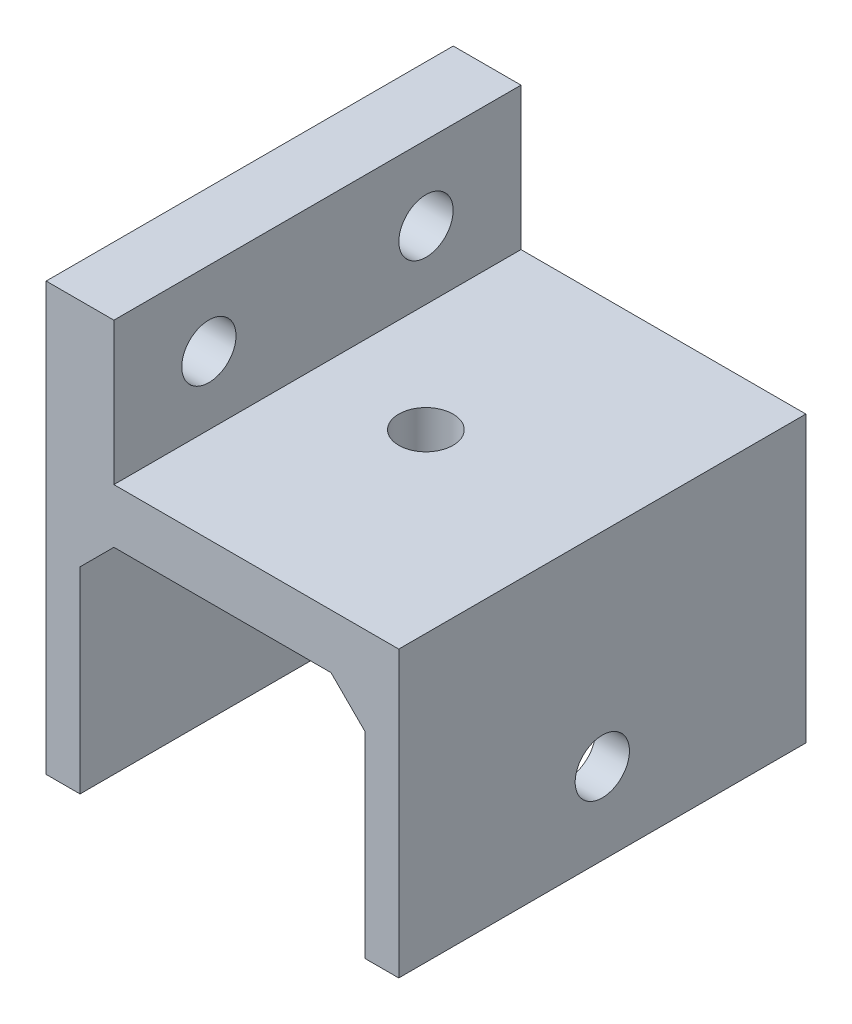
ISO-10303-21;
HEADER;
FILE_DESCRIPTION(('STEP AP214'),'2;1');
FILE_NAME('part.step','',(''),(''),'','','');
FILE_SCHEMA(('AUTOMOTIVE_DESIGN { 1 0 10303 214 1 1 1 1 }'));
ENDSEC;
DATA;
#1=APPLICATION_CONTEXT('core data for automotive mechanical design processes');
#2=APPLICATION_PROTOCOL_DEFINITION('international standard','automotive_design',2000,#1);
#3=PRODUCT_CONTEXT('',#1,'mechanical');
#4=PRODUCT('Part','Part','',(#3));
#5=PRODUCT_RELATED_PRODUCT_CATEGORY('part','',(#4));
#6=PRODUCT_DEFINITION_FORMATION('','',#4);
#7=PRODUCT_DEFINITION_CONTEXT('part definition',#1,'design');
#8=PRODUCT_DEFINITION('design','',#6,#7);
#9=PRODUCT_DEFINITION_SHAPE('','',#8);
#10=(LENGTH_UNIT() NAMED_UNIT(*) SI_UNIT(.MILLI.,.METRE.));
#11=(NAMED_UNIT(*) PLANE_ANGLE_UNIT() SI_UNIT($,.RADIAN.));
#12=(NAMED_UNIT(*) SI_UNIT($,.STERADIAN.) SOLID_ANGLE_UNIT());
#13=UNCERTAINTY_MEASURE_WITH_UNIT(LENGTH_MEASURE(1.E-05),#10,'distance_accuracy_value','');
#14=(GEOMETRIC_REPRESENTATION_CONTEXT(3) GLOBAL_UNCERTAINTY_ASSIGNED_CONTEXT((#13)) GLOBAL_UNIT_ASSIGNED_CONTEXT((#10,
#11,#12)) REPRESENTATION_CONTEXT('',''));
#15=CARTESIAN_POINT('',(0.,0.,0.));
#16=DIRECTION('',(0.,0.,1.));
#17=DIRECTION('',(1.,0.,0.));
#18=AXIS2_PLACEMENT_3D('',#15,#16,#17);
#19=CARTESIAN_POINT('',(108.782918319174,60.385396129652,47.625));
#20=DIRECTION('',(0.,1.,0.));
#21=DIRECTION('',(0.,0.,1.));
#22=AXIS2_PLACEMENT_3D('',#19,#20,#21);
#23=PLANE('',#22);
#24=DIRECTION('',(1.,0.,0.));
#25=VECTOR('',#24,1.);
#26=CARTESIAN_POINT('',(108.782918319174,60.385396129652,0.));
#27=LINE('',#26,#25);
#28=CARTESIAN_POINT('',(108.782918319174,60.385396129652,0.));
#29=VERTEX_POINT('',#28);
#30=CARTESIAN_POINT('',(112.74531832146,60.385396129652,0.));
#31=VERTEX_POINT('',#30);
#32=EDGE_CURVE('E156',#29,#31,#27,.T.);
#33=ORIENTED_EDGE('',*,*,#32,.T.);
#34=DIRECTION('',(0.,0.,-1.));
#35=VECTOR('',#34,1.);
#36=CARTESIAN_POINT('',(112.74531832146,60.385396129652,47.625));
#37=LINE('',#36,#35);
#38=CARTESIAN_POINT('',(112.74531832146,60.385396129652,47.625));
#39=VERTEX_POINT('',#38);
#40=EDGE_CURVE('E11',#39,#31,#37,.T.);
#41=ORIENTED_EDGE('',*,*,#40,.F.);
#42=DIRECTION('',(1.,0.,0.));
#43=VECTOR('',#42,1.);
#44=CARTESIAN_POINT('',(108.782918319174,60.385396129652,47.625));
#45=LINE('',#44,#43);
#46=CARTESIAN_POINT('',(108.782918319174,60.385396129652,47.625));
#47=VERTEX_POINT('',#46);
#48=EDGE_CURVE('E179',#47,#39,#45,.T.);
#49=ORIENTED_EDGE('',*,*,#48,.F.);
#50=DIRECTION('',(0.,0.,-1.));
#51=VECTOR('',#50,1.);
#52=CARTESIAN_POINT('',(108.782918319174,60.385396129652,47.625));
#53=LINE('',#52,#51);
#54=EDGE_CURVE('E152',#47,#29,#53,.T.);
#55=ORIENTED_EDGE('',*,*,#54,.T.);
#56=EDGE_LOOP('',(#33,#41,#49,#55));
#57=FACE_BOUND('',#56,.T.);
#58=ADVANCED_FACE('F34',(#57),#23,.F.);
#59=CARTESIAN_POINT('',(112.74531832146,60.385396129652,47.625));
#60=DIRECTION('',(-1.,0.,0.));
#61=DIRECTION('',(0.,0.,1.));
#62=AXIS2_PLACEMENT_3D('',#59,#60,#61);
#63=PLANE('',#62);
#64=CARTESIAN_POINT('',(112.74531832146,69.910396129652,23.8125));
#65=DIRECTION('',(1.,0.,0.));
#66=DIRECTION('',(0.,0.,-1.));
#67=AXIS2_PLACEMENT_3D('',#64,#65,#66);
#68=CIRCLE('',#67,3.175);
#69=CARTESIAN_POINT('',(112.74531832146,69.910396129652,20.6375));
#70=VERTEX_POINT('',#69);
#71=EDGE_CURVE('E498',#70,#70,#68,.T.);
#72=ORIENTED_EDGE('',*,*,#71,.F.);
#73=EDGE_LOOP('',(#72));
#74=FACE_BOUND('',#73,.T.);
#75=DIRECTION('',(0.,1.,0.));
#76=VECTOR('',#75,1.);
#77=CARTESIAN_POINT('',(112.74531832146,60.385396129652,0.));
#78=LINE('',#77,#76);
#79=CARTESIAN_POINT('',(112.74531832146,93.710196131684,0.));
#80=VERTEX_POINT('',#79);
#81=EDGE_CURVE('E159',#31,#80,#78,.T.);
#82=ORIENTED_EDGE('',*,*,#81,.T.);
#83=DIRECTION('',(0.,0.,-1.));
#84=VECTOR('',#83,1.);
#85=CARTESIAN_POINT('',(112.74531832146,93.710196131684,47.625));
#86=LINE('',#85,#84);
#87=CARTESIAN_POINT('',(112.74531832146,93.710196131684,47.625));
#88=VERTEX_POINT('',#87);
#89=EDGE_CURVE('E43',#88,#80,#86,.T.);
#90=ORIENTED_EDGE('',*,*,#89,.F.);
#91=DIRECTION('',(0.,1.,0.));
#92=VECTOR('',#91,1.);
#93=CARTESIAN_POINT('',(112.74531832146,60.385396129652,47.625));
#94=LINE('',#93,#92);
#95=EDGE_CURVE('E107',#39,#88,#94,.T.);
#96=ORIENTED_EDGE('',*,*,#95,.F.);
#97=ORIENTED_EDGE('',*,*,#40,.T.);
#98=EDGE_LOOP('',(#82,#90,#96,#97));
#99=FACE_BOUND('',#98,.T.);
#100=ADVANCED_FACE('F259',(#74,#99),#63,.F.);
#101=CARTESIAN_POINT('',(112.74531832146,93.710196131684,47.625));
#102=DIRECTION('',(0.,-1.,0.));
#103=DIRECTION('',(0.,0.,-1.));
#104=AXIS2_PLACEMENT_3D('',#101,#102,#103);
#105=PLANE('',#104);
#106=CARTESIAN_POINT('',(92.10781832146,93.710196131684,23.8125));
#107=DIRECTION('',(0.,1.,0.));
#108=DIRECTION('',(0.,0.,1.));
#109=AXIS2_PLACEMENT_3D('',#106,#107,#108);
#110=CIRCLE('',#109,3.175);
#111=CARTESIAN_POINT('',(92.10781832146,93.710196131684,26.9875));
#112=VERTEX_POINT('',#111);
#113=EDGE_CURVE('E203',#112,#112,#110,.T.);
#114=ORIENTED_EDGE('',*,*,#113,.F.);
#115=EDGE_LOOP('',(#114));
#116=FACE_BOUND('',#115,.T.);
#117=DIRECTION('',(-1.,0.,0.));
#118=VECTOR('',#117,1.);
#119=CARTESIAN_POINT('',(112.74531832146,93.710196131684,0.));
#120=LINE('',#119,#118);
#121=CARTESIAN_POINT('',(79.420518319428,93.710196131684,0.));
#122=VERTEX_POINT('',#121);
#123=EDGE_CURVE('E162',#80,#122,#120,.T.);
#124=ORIENTED_EDGE('',*,*,#123,.T.);
#125=DIRECTION('',(0.,0.,-1.));
#126=VECTOR('',#125,1.);
#127=CARTESIAN_POINT('',(79.420518319428,93.710196131684,47.625));
#128=LINE('',#127,#126);
#129=CARTESIAN_POINT('',(79.420518319428,93.710196131684,47.625));
#130=VERTEX_POINT('',#129);
#131=EDGE_CURVE('E198',#130,#122,#128,.T.);
#132=ORIENTED_EDGE('',*,*,#131,.F.);
#133=DIRECTION('',(-1.,0.,0.));
#134=VECTOR('',#133,1.);
#135=CARTESIAN_POINT('',(112.74531832146,93.710196131684,47.625));
#136=LINE('',#135,#134);
#137=EDGE_CURVE('E218',#88,#130,#136,.T.);
#138=ORIENTED_EDGE('',*,*,#137,.F.);
#139=ORIENTED_EDGE('',*,*,#89,.T.);
#140=EDGE_LOOP('',(#124,#132,#138,#139));
#141=FACE_BOUND('',#140,.T.);
#142=ADVANCED_FACE('F263',(#116,#141),#105,.F.);
#143=CARTESIAN_POINT('',(79.420518319428,93.710196131684,47.625));
#144=DIRECTION('',(-1.,0.,0.));
#145=DIRECTION('',(0.,0.,1.));
#146=AXIS2_PLACEMENT_3D('',#143,#144,#145);
#147=PLANE('',#146);
#148=CARTESIAN_POINT('',(79.420518319428,101.660396129652,36.5125));
#149=DIRECTION('',(-1.,0.,0.));
#150=DIRECTION('',(0.,0.,1.));
#151=AXIS2_PLACEMENT_3D('',#148,#149,#150);
#152=CIRCLE('',#151,3.175);
#153=CARTESIAN_POINT('',(79.420518319428,101.660396129652,39.6875));
#154=VERTEX_POINT('',#153);
#155=EDGE_CURVE('E469',#154,#154,#152,.T.);
#156=ORIENTED_EDGE('',*,*,#155,.T.);
#157=EDGE_LOOP('',(#156));
#158=FACE_BOUND('',#157,.T.);
#159=CARTESIAN_POINT('',(79.420518319428,101.660396129652,11.1125));
#160=DIRECTION('',(-1.,0.,0.));
#161=DIRECTION('',(0.,0.,1.));
#162=AXIS2_PLACEMENT_3D('',#159,#160,#161);
#163=CIRCLE('',#162,3.175);
#164=CARTESIAN_POINT('',(79.420518319428,101.660396129652,14.2875));
#165=VERTEX_POINT('',#164);
#166=EDGE_CURVE('E207',#165,#165,#163,.T.);
#167=ORIENTED_EDGE('',*,*,#166,.T.);
#168=EDGE_LOOP('',(#167));
#169=FACE_BOUND('',#168,.T.);
#170=DIRECTION('',(0.,1.,0.));
#171=VECTOR('',#170,1.);
#172=CARTESIAN_POINT('',(79.420518319428,93.710196131684,0.));
#173=LINE('',#172,#171);
#174=CARTESIAN_POINT('',(79.420518319428,110.372596129906,0.));
#175=VERTEX_POINT('',#174);
#176=EDGE_CURVE('E164',#122,#175,#173,.T.);
#177=ORIENTED_EDGE('',*,*,#176,.T.);
#178=DIRECTION('',(0.,0.,-1.));
#179=VECTOR('',#178,1.);
#180=CARTESIAN_POINT('',(79.420518319428,110.372596129906,47.625));
#181=LINE('',#180,#179);
#182=CARTESIAN_POINT('',(79.420518319428,110.372596129906,47.625));
#183=VERTEX_POINT('',#182);
#184=EDGE_CURVE('E195',#183,#175,#181,.T.);
#185=ORIENTED_EDGE('',*,*,#184,.F.);
#186=DIRECTION('',(0.,1.,0.));
#187=VECTOR('',#186,1.);
#188=CARTESIAN_POINT('',(79.420518319428,93.710196131684,47.625));
#189=LINE('',#188,#187);
#190=EDGE_CURVE('E220',#130,#183,#189,.T.);
#191=ORIENTED_EDGE('',*,*,#190,.F.);
#192=ORIENTED_EDGE('',*,*,#131,.T.);
#193=EDGE_LOOP('',(#177,#185,#191,#192));
#194=FACE_BOUND('',#193,.T.);
#195=ADVANCED_FACE('F268',(#158,#169,#194),#147,.F.);
#196=CARTESIAN_POINT('',(79.420518319428,110.372596129906,47.625));
#197=DIRECTION('',(0.,-1.,0.));
#198=DIRECTION('',(0.,0.,-1.));
#199=AXIS2_PLACEMENT_3D('',#196,#197,#198);
#200=PLANE('',#199);
#201=DIRECTION('',(-1.,0.,0.));
#202=VECTOR('',#201,1.);
#203=CARTESIAN_POINT('',(79.420518319428,110.372596129906,0.));
#204=LINE('',#203,#202);
#205=CARTESIAN_POINT('',(71.495718320444,110.372596129906,0.));
#206=VERTEX_POINT('',#205);
#207=EDGE_CURVE('E166',#175,#206,#204,.T.);
#208=ORIENTED_EDGE('',*,*,#207,.T.);
#209=DIRECTION('',(0.,0.,-1.));
#210=VECTOR('',#209,1.);
#211=CARTESIAN_POINT('',(71.495718320444,110.372596129906,47.625));
#212=LINE('',#211,#210);
#213=CARTESIAN_POINT('',(71.495718320444,110.372596129906,47.625));
#214=VERTEX_POINT('',#213);
#215=EDGE_CURVE('E192',#214,#206,#212,.T.);
#216=ORIENTED_EDGE('',*,*,#215,.F.);
#217=DIRECTION('',(-1.,0.,0.));
#218=VECTOR('',#217,1.);
#219=CARTESIAN_POINT('',(79.420518319428,110.372596129906,47.625));
#220=LINE('',#219,#218);
#221=EDGE_CURVE('E222',#183,#214,#220,.T.);
#222=ORIENTED_EDGE('',*,*,#221,.F.);
#223=ORIENTED_EDGE('',*,*,#184,.T.);
#224=EDGE_LOOP('',(#208,#216,#222,#223));
#225=FACE_BOUND('',#224,.T.);
#226=ADVANCED_FACE('F275',(#225),#200,.F.);
#227=CARTESIAN_POINT('',(71.495718320444,110.372596129906,47.625));
#228=DIRECTION('',(1.,0.,0.));
#229=DIRECTION('',(0.,0.,-1.));
#230=AXIS2_PLACEMENT_3D('',#227,#228,#229);
#231=PLANE('',#230);
#232=CARTESIAN_POINT('',(71.495718320444,69.910396129652,23.8125));
#233=DIRECTION('',(1.,0.,0.));
#234=DIRECTION('',(0.,0.,-1.));
#235=AXIS2_PLACEMENT_3D('',#232,#233,#234);
#236=CIRCLE('',#235,3.175);
#237=CARTESIAN_POINT('',(71.495718320444,69.910396129652,20.6375));
#238=VERTEX_POINT('',#237);
#239=EDGE_CURVE('E465',#238,#238,#236,.T.);
#240=ORIENTED_EDGE('',*,*,#239,.T.);
#241=EDGE_LOOP('',(#240));
#242=FACE_BOUND('',#241,.T.);
#243=CARTESIAN_POINT('',(71.495718320444,101.660396129652,36.5125));
#244=DIRECTION('',(-1.,0.,0.));
#245=DIRECTION('',(0.,0.,1.));
#246=AXIS2_PLACEMENT_3D('',#243,#244,#245);
#247=CIRCLE('',#246,3.175);
#248=CARTESIAN_POINT('',(71.495718320444,101.660396129652,39.6875));
#249=VERTEX_POINT('',#248);
#250=EDGE_CURVE('E466',#249,#249,#247,.T.);
#251=ORIENTED_EDGE('',*,*,#250,.F.);
#252=EDGE_LOOP('',(#251));
#253=FACE_BOUND('',#252,.T.);
#254=CARTESIAN_POINT('',(71.495718320444,101.660396129652,11.1125));
#255=DIRECTION('',(-1.,0.,0.));
#256=DIRECTION('',(0.,0.,1.));
#257=AXIS2_PLACEMENT_3D('',#254,#255,#256);
#258=CIRCLE('',#257,3.175);
#259=CARTESIAN_POINT('',(71.495718320444,101.660396129652,14.2875));
#260=VERTEX_POINT('',#259);
#261=EDGE_CURVE('E212',#260,#260,#258,.T.);
#262=ORIENTED_EDGE('',*,*,#261,.F.);
#263=EDGE_LOOP('',(#262));
#264=FACE_BOUND('',#263,.T.);
#265=DIRECTION('',(0.,-1.,0.));
#266=VECTOR('',#265,1.);
#267=CARTESIAN_POINT('',(71.495718320444,110.372596129906,0.));
#268=LINE('',#267,#266);
#269=CARTESIAN_POINT('',(71.495718320444,60.385396129652,0.));
#270=VERTEX_POINT('',#269);
#271=EDGE_CURVE('E168',#206,#270,#268,.T.);
#272=ORIENTED_EDGE('',*,*,#271,.T.);
#273=DIRECTION('',(0.,0.,-1.));
#274=VECTOR('',#273,1.);
#275=CARTESIAN_POINT('',(71.495718320444,60.385396129652,47.625));
#276=LINE('',#275,#274);
#277=CARTESIAN_POINT('',(71.495718320444,60.385396129652,47.625));
#278=VERTEX_POINT('',#277);
#279=EDGE_CURVE('E189',#278,#270,#276,.T.);
#280=ORIENTED_EDGE('',*,*,#279,.F.);
#281=DIRECTION('',(0.,-1.,0.));
#282=VECTOR('',#281,1.);
#283=CARTESIAN_POINT('',(71.495718320444,110.372596129906,47.625));
#284=LINE('',#283,#282);
#285=EDGE_CURVE('E224',#214,#278,#284,.T.);
#286=ORIENTED_EDGE('',*,*,#285,.F.);
#287=ORIENTED_EDGE('',*,*,#215,.T.);
#288=EDGE_LOOP('',(#272,#280,#286,#287));
#289=FACE_BOUND('',#288,.T.);
#290=ADVANCED_FACE('F279',(#242,#253,#264,#289),#231,.F.);
#291=CARTESIAN_POINT('',(71.495718320444,60.385396129652,47.625));
#292=DIRECTION('',(0.,1.,0.));
#293=DIRECTION('',(0.,0.,1.));
#294=AXIS2_PLACEMENT_3D('',#291,#292,#293);
#295=PLANE('',#294);
#296=DIRECTION('',(1.,0.,0.));
#297=VECTOR('',#296,1.);
#298=CARTESIAN_POINT('',(71.495718320444,60.385396129652,0.));
#299=LINE('',#298,#297);
#300=CARTESIAN_POINT('',(75.458118319936,60.385396129652,0.));
#301=VERTEX_POINT('',#300);
#302=EDGE_CURVE('E170',#270,#301,#299,.T.);
#303=ORIENTED_EDGE('',*,*,#302,.T.);
#304=DIRECTION('',(0.,0.,-1.));
#305=VECTOR('',#304,1.);
#306=CARTESIAN_POINT('',(75.458118319936,60.385396129652,47.625));
#307=LINE('',#306,#305);
#308=CARTESIAN_POINT('',(75.458118319936,60.385396129652,47.625));
#309=VERTEX_POINT('',#308);
#310=EDGE_CURVE('E186',#309,#301,#307,.T.);
#311=ORIENTED_EDGE('',*,*,#310,.F.);
#312=DIRECTION('',(1.,0.,0.));
#313=VECTOR('',#312,1.);
#314=CARTESIAN_POINT('',(71.495718320444,60.385396129652,47.625));
#315=LINE('',#314,#313);
#316=EDGE_CURVE('E226',#278,#309,#315,.T.);
#317=ORIENTED_EDGE('',*,*,#316,.F.);
#318=ORIENTED_EDGE('',*,*,#279,.T.);
#319=EDGE_LOOP('',(#303,#311,#317,#318));
#320=FACE_BOUND('',#319,.T.);
#321=ADVANCED_FACE('F283',(#320),#295,.F.);
#322=CARTESIAN_POINT('',(75.458118319936,60.385396129652,47.625));
#323=DIRECTION('',(-1.,0.,0.));
#324=DIRECTION('',(0.,0.,1.));
#325=AXIS2_PLACEMENT_3D('',#322,#323,#324);
#326=PLANE('',#325);
#327=CARTESIAN_POINT('',(75.458118319936,69.910396129652,23.8125));
#328=DIRECTION('',(-1.,0.,0.));
#329=DIRECTION('',(0.,0.,1.));
#330=AXIS2_PLACEMENT_3D('',#327,#328,#329);
#331=CIRCLE('',#330,3.175);
#332=CARTESIAN_POINT('',(75.458118319936,69.910396129652,26.9875));
#333=VERTEX_POINT('',#332);
#334=EDGE_CURVE('E462',#333,#333,#331,.T.);
#335=ORIENTED_EDGE('',*,*,#334,.T.);
#336=EDGE_LOOP('',(#335));
#337=FACE_BOUND('',#336,.T.);
#338=DIRECTION('',(0.,1.,0.));
#339=VECTOR('',#338,1.);
#340=CARTESIAN_POINT('',(75.458118319936,60.385396129652,0.));
#341=LINE('',#340,#339);
#342=CARTESIAN_POINT('',(75.458118319936,83.39779613143,0.));
#343=VERTEX_POINT('',#342);
#344=EDGE_CURVE('E172',#301,#343,#341,.T.);
#345=ORIENTED_EDGE('',*,*,#344,.T.);
#346=DIRECTION('',(0.,0.,-1.));
#347=VECTOR('',#346,1.);
#348=CARTESIAN_POINT('',(75.458118319936,83.39779613143,47.625));
#349=LINE('',#348,#347);
#350=CARTESIAN_POINT('',(75.458118319936,83.39779613143,47.625));
#351=VERTEX_POINT('',#350);
#352=EDGE_CURVE('E183',#351,#343,#349,.T.);
#353=ORIENTED_EDGE('',*,*,#352,.F.);
#354=DIRECTION('',(0.,1.,0.));
#355=VECTOR('',#354,1.);
#356=CARTESIAN_POINT('',(75.458118319936,60.385396129652,47.625));
#357=LINE('',#356,#355);
#358=EDGE_CURVE('E228',#309,#351,#357,.T.);
#359=ORIENTED_EDGE('',*,*,#358,.F.);
#360=ORIENTED_EDGE('',*,*,#310,.T.);
#361=EDGE_LOOP('',(#345,#353,#359,#360));
#362=FACE_BOUND('',#361,.T.);
#363=ADVANCED_FACE('F234',(#337,#362),#326,.F.);
#364=CARTESIAN_POINT('',(75.458118319936,83.39779613143,47.625));
#365=DIRECTION('',(-0.707106781186549,0.707106781186546,0.));
#366=DIRECTION('',(-0.707106781186546,-0.707106781186549,0.));
#367=AXIS2_PLACEMENT_3D('',#364,#365,#366);
#368=PLANE('',#367);
#369=DIRECTION('',(0.707106781186546,0.707106781186549,0.));
#370=VECTOR('',#369,1.);
#371=CARTESIAN_POINT('',(75.458118319936,83.39779613143,0.));
#372=LINE('',#371,#370);
#373=CARTESIAN_POINT('',(79.420518319428,87.360196130922,0.));
#374=VERTEX_POINT('',#373);
#375=EDGE_CURVE('E174',#343,#374,#372,.T.);
#376=ORIENTED_EDGE('',*,*,#375,.T.);
#377=DIRECTION('',(0.,0.,-1.));
#378=VECTOR('',#377,1.);
#379=CARTESIAN_POINT('',(79.420518319428,87.360196130922,47.625));
#380=LINE('',#379,#378);
#381=CARTESIAN_POINT('',(79.420518319428,87.360196130922,47.625));
#382=VERTEX_POINT('',#381);
#383=EDGE_CURVE('E147',#382,#374,#380,.T.);
#384=ORIENTED_EDGE('',*,*,#383,.F.);
#385=DIRECTION('',(0.707106781186546,0.707106781186549,0.));
#386=VECTOR('',#385,1.);
#387=CARTESIAN_POINT('',(75.458118319936,83.39779613143,47.625));
#388=LINE('',#387,#386);
#389=EDGE_CURVE('E138',#351,#382,#388,.T.);
#390=ORIENTED_EDGE('',*,*,#389,.F.);
#391=ORIENTED_EDGE('',*,*,#352,.T.);
#392=EDGE_LOOP('',(#376,#384,#390,#391));
#393=FACE_BOUND('',#392,.T.);
#394=ADVANCED_FACE('F238',(#393),#368,.F.);
#395=CARTESIAN_POINT('',(79.420518319428,87.360196130922,47.625));
#396=DIRECTION('',(0.,1.,0.));
#397=DIRECTION('',(0.,0.,1.));
#398=AXIS2_PLACEMENT_3D('',#395,#396,#397);
#399=PLANE('',#398);
#400=CARTESIAN_POINT('',(92.10781832146,87.360196130922,23.8125));
#401=DIRECTION('',(0.,1.,0.));
#402=DIRECTION('',(0.,0.,1.));
#403=AXIS2_PLACEMENT_3D('',#400,#401,#402);
#404=CIRCLE('',#403,3.175);
#405=CARTESIAN_POINT('',(92.10781832146,87.360196130922,26.9875));
#406=VERTEX_POINT('',#405);
#407=EDGE_CURVE('E160',#406,#406,#404,.T.);
#408=ORIENTED_EDGE('',*,*,#407,.T.);
#409=EDGE_LOOP('',(#408));
#410=FACE_BOUND('',#409,.T.);
#411=DIRECTION('',(1.,0.,0.));
#412=VECTOR('',#411,1.);
#413=CARTESIAN_POINT('',(79.420518319428,87.360196130922,0.));
#414=LINE('',#413,#412);
#415=CARTESIAN_POINT('',(104.820518319682,87.360196130922,0.));
#416=VERTEX_POINT('',#415);
#417=EDGE_CURVE('E146',#374,#416,#414,.T.);
#418=ORIENTED_EDGE('',*,*,#417,.T.);
#419=DIRECTION('',(0.,0.,-1.));
#420=VECTOR('',#419,1.);
#421=CARTESIAN_POINT('',(104.820518319682,87.360196130922,47.625));
#422=LINE('',#421,#420);
#423=CARTESIAN_POINT('',(104.820518319682,87.360196130922,47.625));
#424=VERTEX_POINT('',#423);
#425=EDGE_CURVE('E143',#424,#416,#422,.T.);
#426=ORIENTED_EDGE('',*,*,#425,.F.);
#427=DIRECTION('',(1.,0.,0.));
#428=VECTOR('',#427,1.);
#429=CARTESIAN_POINT('',(79.420518319428,87.360196130922,47.625));
#430=LINE('',#429,#428);
#431=EDGE_CURVE('E132',#382,#424,#430,.T.);
#432=ORIENTED_EDGE('',*,*,#431,.F.);
#433=ORIENTED_EDGE('',*,*,#383,.T.);
#434=EDGE_LOOP('',(#418,#426,#432,#433));
#435=FACE_BOUND('',#434,.T.);
#436=ADVANCED_FACE('F144',(#410,#435),#399,.F.);
#437=CARTESIAN_POINT('',(104.820518319682,87.360196130922,47.625));
#438=DIRECTION('',(0.707106781186548,0.707106781186548,0.));
#439=DIRECTION('',(-0.707106781186548,0.707106781186548,0.));
#440=AXIS2_PLACEMENT_3D('',#437,#438,#439);
#441=PLANE('',#440);
#442=DIRECTION('',(0.707106781186548,-0.707106781186548,0.));
#443=VECTOR('',#442,1.);
#444=CARTESIAN_POINT('',(104.820518319682,87.360196130922,0.));
#445=LINE('',#444,#443);
#446=CARTESIAN_POINT('',(108.782918319174,83.39779613143,0.));
#447=VERTEX_POINT('',#446);
#448=EDGE_CURVE('E93',#416,#447,#445,.T.);
#449=ORIENTED_EDGE('',*,*,#448,.T.);
#450=DIRECTION('',(0.,0.,-1.));
#451=VECTOR('',#450,1.);
#452=CARTESIAN_POINT('',(108.782918319174,83.39779613143,47.625));
#453=LINE('',#452,#451);
#454=CARTESIAN_POINT('',(108.782918319174,83.39779613143,47.625));
#455=VERTEX_POINT('',#454);
#456=EDGE_CURVE('E148',#455,#447,#453,.T.);
#457=ORIENTED_EDGE('',*,*,#456,.F.);
#458=DIRECTION('',(0.707106781186548,-0.707106781186548,0.));
#459=VECTOR('',#458,1.);
#460=CARTESIAN_POINT('',(104.820518319682,87.360196130922,47.625));
#461=LINE('',#460,#459);
#462=EDGE_CURVE('E136',#424,#455,#461,.T.);
#463=ORIENTED_EDGE('',*,*,#462,.F.);
#464=ORIENTED_EDGE('',*,*,#425,.T.);
#465=EDGE_LOOP('',(#449,#457,#463,#464));
#466=FACE_BOUND('',#465,.T.);
#467=ADVANCED_FACE('F150',(#466),#441,.F.);
#468=CARTESIAN_POINT('',(108.782918319174,83.39779613143,47.625));
#469=DIRECTION('',(1.,0.,0.));
#470=DIRECTION('',(0.,0.,-1.));
#471=AXIS2_PLACEMENT_3D('',#468,#469,#470);
#472=PLANE('',#471);
#473=CARTESIAN_POINT('',(108.782918319174,69.910396129652,23.8125));
#474=DIRECTION('',(1.,0.,0.));
#475=DIRECTION('',(0.,0.,-1.));
#476=AXIS2_PLACEMENT_3D('',#473,#474,#475);
#477=CIRCLE('',#476,3.175);
#478=CARTESIAN_POINT('',(108.782918319174,69.910396129652,20.6375));
#479=VERTEX_POINT('',#478);
#480=EDGE_CURVE('E37',#479,#479,#477,.T.);
#481=ORIENTED_EDGE('',*,*,#480,.T.);
#482=EDGE_LOOP('',(#481));
#483=FACE_BOUND('',#482,.T.);
#484=DIRECTION('',(0.,-1.,0.));
#485=VECTOR('',#484,1.);
#486=CARTESIAN_POINT('',(108.782918319174,83.39779613143,0.));
#487=LINE('',#486,#485);
#488=EDGE_CURVE('E99',#447,#29,#487,.T.);
#489=ORIENTED_EDGE('',*,*,#488,.T.);
#490=ORIENTED_EDGE('',*,*,#54,.F.);
#491=DIRECTION('',(0.,-1.,0.));
#492=VECTOR('',#491,1.);
#493=CARTESIAN_POINT('',(108.782918319174,83.39779613143,47.625));
#494=LINE('',#493,#492);
#495=EDGE_CURVE('E52',#455,#47,#494,.T.);
#496=ORIENTED_EDGE('',*,*,#495,.F.);
#497=ORIENTED_EDGE('',*,*,#456,.T.);
#498=EDGE_LOOP('',(#489,#490,#496,#497));
#499=FACE_BOUND('',#498,.T.);
#500=ADVANCED_FACE('F246',(#483,#499),#472,.F.);
#501=CARTESIAN_POINT('',(0.,0.,47.625));
#502=DIRECTION('',(0.,0.,1.));
#503=DIRECTION('',(1.,0.,0.));
#504=AXIS2_PLACEMENT_3D('',#501,#502,#503);
#505=PLANE('',#504);
#506=ORIENTED_EDGE('',*,*,#48,.T.);
#507=ORIENTED_EDGE('',*,*,#95,.T.);
#508=ORIENTED_EDGE('',*,*,#137,.T.);
#509=ORIENTED_EDGE('',*,*,#190,.T.);
#510=ORIENTED_EDGE('',*,*,#221,.T.);
#511=ORIENTED_EDGE('',*,*,#285,.T.);
#512=ORIENTED_EDGE('',*,*,#316,.T.);
#513=ORIENTED_EDGE('',*,*,#358,.T.);
#514=ORIENTED_EDGE('',*,*,#389,.T.);
#515=ORIENTED_EDGE('',*,*,#431,.T.);
#516=ORIENTED_EDGE('',*,*,#462,.T.);
#517=ORIENTED_EDGE('',*,*,#495,.T.);
#518=EDGE_LOOP('',(#506,#507,#508,#509,#510,#511,#512,#513,#514,#515,#516,#517));
#519=FACE_BOUND('',#518,.T.);
#520=ADVANCED_FACE('F134',(#519),#505,.T.);
#521=CARTESIAN_POINT('',(0.,0.,0.));
#522=DIRECTION('',(0.,0.,1.));
#523=DIRECTION('',(1.,0.,0.));
#524=AXIS2_PLACEMENT_3D('',#521,#522,#523);
#525=PLANE('',#524);
#526=ORIENTED_EDGE('',*,*,#32,.F.);
#527=ORIENTED_EDGE('',*,*,#488,.F.);
#528=ORIENTED_EDGE('',*,*,#448,.F.);
#529=ORIENTED_EDGE('',*,*,#417,.F.);
#530=ORIENTED_EDGE('',*,*,#375,.F.);
#531=ORIENTED_EDGE('',*,*,#344,.F.);
#532=ORIENTED_EDGE('',*,*,#302,.F.);
#533=ORIENTED_EDGE('',*,*,#271,.F.);
#534=ORIENTED_EDGE('',*,*,#207,.F.);
#535=ORIENTED_EDGE('',*,*,#176,.F.);
#536=ORIENTED_EDGE('',*,*,#123,.F.);
#537=ORIENTED_EDGE('',*,*,#81,.F.);
#538=EDGE_LOOP('',(#526,#527,#528,#529,#530,#531,#532,#533,#534,#535,#536,#537));
#539=FACE_BOUND('',#538,.T.);
#540=ADVANCED_FACE('F241',(#539),#525,.F.);
#541=CARTESIAN_POINT('',(92.10781832146,60.385396129652,23.8125));
#542=DIRECTION('',(0.,1.,0.));
#543=DIRECTION('',(0.,0.,1.));
#544=AXIS2_PLACEMENT_3D('',#541,#542,#543);
#545=CYLINDRICAL_SURFACE('',#544,3.175);
#546=ORIENTED_EDGE('',*,*,#113,.T.);
#547=EDGE_LOOP('',(#546));
#548=FACE_BOUND('',#547,.T.);
#549=ORIENTED_EDGE('',*,*,#407,.F.);
#550=EDGE_LOOP('',(#549));
#551=FACE_BOUND('',#550,.T.);
#552=ADVANCED_FACE('F324',(#548,#551),#545,.F.);
#553=CARTESIAN_POINT('',(112.74531832146,101.660396129652,11.1125));
#554=DIRECTION('',(-1.,0.,0.));
#555=DIRECTION('',(0.,0.,1.));
#556=AXIS2_PLACEMENT_3D('',#553,#554,#555);
#557=CYLINDRICAL_SURFACE('',#556,3.175);
#558=CARTESIAN_POINT('',(71.495718320444,101.660396129652,14.2875));
#559=CARTESIAN_POINT('',(71.5782683204334,101.660396129652,14.2875));
#560=CARTESIAN_POINT('',(71.6608183204228,101.660396129652,14.2875));
#561=CARTESIAN_POINT('',(71.8259183204017,101.660396129652,14.2875));
#562=CARTESIAN_POINT('',(71.9084683203911,101.660396129652,14.2875));
#563=CARTESIAN_POINT('',(72.0735683203699,101.660396129652,14.2875));
#564=CARTESIAN_POINT('',(72.1561183203593,101.660396129652,14.2875));
#565=CARTESIAN_POINT('',(72.3212183203382,101.660396129652,14.2875));
#566=CARTESIAN_POINT('',(72.4037683203276,101.660396129652,14.2875));
#567=CARTESIAN_POINT('',(72.5688683203064,101.660396129652,14.2875));
#568=CARTESIAN_POINT('',(72.6514183202958,101.660396129652,14.2875));
#569=CARTESIAN_POINT('',(72.8165183202747,101.660396129652,14.2875));
#570=CARTESIAN_POINT('',(72.8990683202641,101.660396129652,14.2875));
#571=CARTESIAN_POINT('',(73.0641683202429,101.660396129652,14.2875));
#572=CARTESIAN_POINT('',(73.1467183202323,101.660396129652,14.2875));
#573=CARTESIAN_POINT('',(73.3118183202112,101.660396129652,14.2875));
#574=CARTESIAN_POINT('',(73.3943683202006,101.660396129652,14.2875));
#575=CARTESIAN_POINT('',(73.5594683201794,101.660396129652,14.2875));
#576=CARTESIAN_POINT('',(73.6420183201688,101.660396129652,14.2875));
#577=CARTESIAN_POINT('',(73.8071183201477,101.660396129652,14.2875));
#578=CARTESIAN_POINT('',(73.8896683201371,101.660396129652,14.2875));
#579=CARTESIAN_POINT('',(74.0547683201159,101.660396129652,14.2875));
#580=CARTESIAN_POINT('',(74.1373183201053,101.660396129652,14.2875));
#581=CARTESIAN_POINT('',(74.3024183200842,101.660396129652,14.2875));
#582=CARTESIAN_POINT('',(74.3849683200736,101.660396129652,14.2875));
#583=CARTESIAN_POINT('',(74.5500683200524,101.660396129652,14.2875));
#584=CARTESIAN_POINT('',(74.6326183200418,101.660396129652,14.2875));
#585=CARTESIAN_POINT('',(74.7977183200207,101.660396129652,14.2875));
#586=CARTESIAN_POINT('',(74.8802683200101,101.660396129652,14.2875));
#587=CARTESIAN_POINT('',(75.0453683199889,101.660396129652,14.2875));
#588=CARTESIAN_POINT('',(75.1279183199783,101.660396129652,14.2875));
#589=CARTESIAN_POINT('',(75.2930183199572,101.660396129652,14.2875));
#590=CARTESIAN_POINT('',(75.3755683199466,101.660396129652,14.2875));
#591=CARTESIAN_POINT('',(75.5406683199254,101.660396129652,14.2875));
#592=CARTESIAN_POINT('',(75.6232183199148,101.660396129652,14.2875));
#593=CARTESIAN_POINT('',(75.7883183198937,101.660396129652,14.2875));
#594=CARTESIAN_POINT('',(75.8708683198831,101.660396129652,14.2875));
#595=CARTESIAN_POINT('',(76.0359683198619,101.660396129652,14.2875));
#596=CARTESIAN_POINT('',(76.1185183198513,101.660396129652,14.2875));
#597=CARTESIAN_POINT('',(76.2836183198302,101.660396129652,14.2875));
#598=CARTESIAN_POINT('',(76.3661683198196,101.660396129652,14.2875));
#599=CARTESIAN_POINT('',(76.5312683197984,101.660396129652,14.2875));
#600=CARTESIAN_POINT('',(76.6138183197878,101.660396129652,14.2875));
#601=CARTESIAN_POINT('',(76.7789183197667,101.660396129652,14.2875));
#602=CARTESIAN_POINT('',(76.8614683197561,101.660396129652,14.2875));
#603=CARTESIAN_POINT('',(77.0265683197349,101.660396129652,14.2875));
#604=CARTESIAN_POINT('',(77.1091183197243,101.660396129652,14.2875));
#605=CARTESIAN_POINT('',(77.2742183197032,101.660396129652,14.2875));
#606=CARTESIAN_POINT('',(77.3567683196926,101.660396129652,14.2875));
#607=CARTESIAN_POINT('',(77.5218683196714,101.660396129652,14.2875));
#608=CARTESIAN_POINT('',(77.6044183196608,101.660396129652,14.2875));
#609=CARTESIAN_POINT('',(77.7695183196397,101.660396129652,14.2875));
#610=CARTESIAN_POINT('',(77.8520683196291,101.660396129652,14.2875));
#611=CARTESIAN_POINT('',(78.0171683196079,101.660396129652,14.2875));
#612=CARTESIAN_POINT('',(78.0997183195973,101.660396129652,14.2875));
#613=CARTESIAN_POINT('',(78.2648183195762,101.660396129652,14.2875));
#614=CARTESIAN_POINT('',(78.3473683195656,101.660396129652,14.2875));
#615=CARTESIAN_POINT('',(78.5124683195444,101.660396129652,14.2875));
#616=CARTESIAN_POINT('',(78.5950183195338,101.660396129652,14.2875));
#617=CARTESIAN_POINT('',(78.7601183195127,101.660396129652,14.2875));
#618=CARTESIAN_POINT('',(78.8426683195021,101.660396129652,14.2875));
#619=CARTESIAN_POINT('',(79.0077683194809,101.660396129652,14.2875));
#620=CARTESIAN_POINT('',(79.0903183194703,101.660396129652,14.2875));
#621=CARTESIAN_POINT('',(79.2554183194492,101.660396129652,14.2875));
#622=CARTESIAN_POINT('',(79.3379683194386,101.660396129652,14.2875));
#623=CARTESIAN_POINT('',(79.420518319428,101.660396129652,14.2875));
#624=B_SPLINE_CURVE_WITH_KNOTS('',3,(#558,#559,#560,#561,#562,#563,#564,#565,#566,#567,#568,
#569,#570,#571,#572,#573,#574,#575,#576,#577,#578,#579,#580,#581,#582,#583,#584,#585,#586,#587,
#588,#589,#590,#591,#592,#593,#594,#595,#596,#597,#598,#599,#600,#601,#602,#603,#604,#605,#606,
#607,#608,#609,#610,#611,#612,#613,#614,#615,#616,#617,#618,#619,#620,#621,#622,#623),
.UNSPECIFIED.,.F.,.F.,(4,2,2,2,2,2,2,2,2,2,2,2,2,2,2,2,2,2,2,2,2,2,2,2,2,2,2,2,2,2,2,2,4),(0.,
0.247649999968236,0.495299999936499,0.742949999904735,0.990599999872999,1.23824999984123,
1.4858999998095,1.73354999977773,1.981199999746,2.22884999971423,2.4764999996825,
2.72414999965073,2.971799999619,3.21944999958723,3.4670999995555,3.71474999952373,
3.96239999949199,4.21004999946023,4.45769999942849,4.70534999939673,4.95299999936499,
5.20064999933323,5.44829999930149,5.69594999926973,5.94359999923799,6.19124999920623,
6.43889999917449,6.68654999914273,6.93419999911099,7.18184999907923,7.42949999904749,
7.67714999901573,7.92479999898399),.UNSPECIFIED.);
#625=EDGE_CURVE('BSEAM333',#260,#165,#624,.T.);
#626=ORIENTED_EDGE('',*,*,#261,.T.);
#627=ORIENTED_EDGE('',*,*,#166,.F.);
#628=ORIENTED_EDGE('',*,*,#625,.T.);
#629=ORIENTED_EDGE('',*,*,#625,.F.);
#630=EDGE_LOOP('',(#626,#628,#627,#629));
#631=FACE_BOUND('',#630,.T.);
#632=ADVANCED_FACE('F333',(#631),#557,.F.);
#633=CARTESIAN_POINT('',(112.74531832146,101.660396129652,36.5125));
#634=DIRECTION('',(-1.,0.,0.));
#635=DIRECTION('',(0.,0.,1.));
#636=AXIS2_PLACEMENT_3D('',#633,#634,#635);
#637=CYLINDRICAL_SURFACE('',#636,3.175);
#638=CARTESIAN_POINT('',(71.495718320444,101.660396129652,39.6875));
#639=CARTESIAN_POINT('',(71.5782683204334,101.660396129652,39.6875));
#640=CARTESIAN_POINT('',(71.6608183204228,101.660396129652,39.6875));
#641=CARTESIAN_POINT('',(71.8259183204017,101.660396129652,39.6875));
#642=CARTESIAN_POINT('',(71.9084683203911,101.660396129652,39.6875));
#643=CARTESIAN_POINT('',(72.0735683203699,101.660396129652,39.6875));
#644=CARTESIAN_POINT('',(72.1561183203593,101.660396129652,39.6875));
#645=CARTESIAN_POINT('',(72.3212183203382,101.660396129652,39.6875));
#646=CARTESIAN_POINT('',(72.4037683203276,101.660396129652,39.6875));
#647=CARTESIAN_POINT('',(72.5688683203064,101.660396129652,39.6875));
#648=CARTESIAN_POINT('',(72.6514183202958,101.660396129652,39.6875));
#649=CARTESIAN_POINT('',(72.8165183202747,101.660396129652,39.6875));
#650=CARTESIAN_POINT('',(72.8990683202641,101.660396129652,39.6875));
#651=CARTESIAN_POINT('',(73.0641683202429,101.660396129652,39.6875));
#652=CARTESIAN_POINT('',(73.1467183202323,101.660396129652,39.6875));
#653=CARTESIAN_POINT('',(73.3118183202112,101.660396129652,39.6875));
#654=CARTESIAN_POINT('',(73.3943683202006,101.660396129652,39.6875));
#655=CARTESIAN_POINT('',(73.5594683201794,101.660396129652,39.6875));
#656=CARTESIAN_POINT('',(73.6420183201688,101.660396129652,39.6875));
#657=CARTESIAN_POINT('',(73.8071183201477,101.660396129652,39.6875));
#658=CARTESIAN_POINT('',(73.8896683201371,101.660396129652,39.6875));
#659=CARTESIAN_POINT('',(74.0547683201159,101.660396129652,39.6875));
#660=CARTESIAN_POINT('',(74.1373183201053,101.660396129652,39.6875));
#661=CARTESIAN_POINT('',(74.3024183200842,101.660396129652,39.6875));
#662=CARTESIAN_POINT('',(74.3849683200736,101.660396129652,39.6875));
#663=CARTESIAN_POINT('',(74.5500683200524,101.660396129652,39.6875));
#664=CARTESIAN_POINT('',(74.6326183200418,101.660396129652,39.6875));
#665=CARTESIAN_POINT('',(74.7977183200207,101.660396129652,39.6875));
#666=CARTESIAN_POINT('',(74.8802683200101,101.660396129652,39.6875));
#667=CARTESIAN_POINT('',(75.0453683199889,101.660396129652,39.6875));
#668=CARTESIAN_POINT('',(75.1279183199783,101.660396129652,39.6875));
#669=CARTESIAN_POINT('',(75.2930183199572,101.660396129652,39.6875));
#670=CARTESIAN_POINT('',(75.3755683199466,101.660396129652,39.6875));
#671=CARTESIAN_POINT('',(75.5406683199254,101.660396129652,39.6875));
#672=CARTESIAN_POINT('',(75.6232183199148,101.660396129652,39.6875));
#673=CARTESIAN_POINT('',(75.7883183198937,101.660396129652,39.6875));
#674=CARTESIAN_POINT('',(75.8708683198831,101.660396129652,39.6875));
#675=CARTESIAN_POINT('',(76.0359683198619,101.660396129652,39.6875));
#676=CARTESIAN_POINT('',(76.1185183198513,101.660396129652,39.6875));
#677=CARTESIAN_POINT('',(76.2836183198302,101.660396129652,39.6875));
#678=CARTESIAN_POINT('',(76.3661683198196,101.660396129652,39.6875));
#679=CARTESIAN_POINT('',(76.5312683197984,101.660396129652,39.6875));
#680=CARTESIAN_POINT('',(76.6138183197878,101.660396129652,39.6875));
#681=CARTESIAN_POINT('',(76.7789183197667,101.660396129652,39.6875));
#682=CARTESIAN_POINT('',(76.8614683197561,101.660396129652,39.6875));
#683=CARTESIAN_POINT('',(77.0265683197349,101.660396129652,39.6875));
#684=CARTESIAN_POINT('',(77.1091183197243,101.660396129652,39.6875));
#685=CARTESIAN_POINT('',(77.2742183197032,101.660396129652,39.6875));
#686=CARTESIAN_POINT('',(77.3567683196926,101.660396129652,39.6875));
#687=CARTESIAN_POINT('',(77.5218683196714,101.660396129652,39.6875));
#688=CARTESIAN_POINT('',(77.6044183196608,101.660396129652,39.6875));
#689=CARTESIAN_POINT('',(77.7695183196397,101.660396129652,39.6875));
#690=CARTESIAN_POINT('',(77.8520683196291,101.660396129652,39.6875));
#691=CARTESIAN_POINT('',(78.0171683196079,101.660396129652,39.6875));
#692=CARTESIAN_POINT('',(78.0997183195973,101.660396129652,39.6875));
#693=CARTESIAN_POINT('',(78.2648183195762,101.660396129652,39.6875));
#694=CARTESIAN_POINT('',(78.3473683195656,101.660396129652,39.6875));
#695=CARTESIAN_POINT('',(78.5124683195444,101.660396129652,39.6875));
#696=CARTESIAN_POINT('',(78.5950183195338,101.660396129652,39.6875));
#697=CARTESIAN_POINT('',(78.7601183195127,101.660396129652,39.6875));
#698=CARTESIAN_POINT('',(78.8426683195021,101.660396129652,39.6875));
#699=CARTESIAN_POINT('',(79.0077683194809,101.660396129652,39.6875));
#700=CARTESIAN_POINT('',(79.0903183194703,101.660396129652,39.6875));
#701=CARTESIAN_POINT('',(79.2554183194492,101.660396129652,39.6875));
#702=CARTESIAN_POINT('',(79.3379683194386,101.660396129652,39.6875));
#703=CARTESIAN_POINT('',(79.420518319428,101.660396129652,39.6875));
#704=B_SPLINE_CURVE_WITH_KNOTS('',3,(#638,#639,#640,#641,#642,#643,#644,#645,#646,#647,#648,
#649,#650,#651,#652,#653,#654,#655,#656,#657,#658,#659,#660,#661,#662,#663,#664,#665,#666,#667,
#668,#669,#670,#671,#672,#673,#674,#675,#676,#677,#678,#679,#680,#681,#682,#683,#684,#685,#686,
#687,#688,#689,#690,#691,#692,#693,#694,#695,#696,#697,#698,#699,#700,#701,#702,#703),
.UNSPECIFIED.,.F.,.F.,(4,2,2,2,2,2,2,2,2,2,2,2,2,2,2,2,2,2,2,2,2,2,2,2,2,2,2,2,2,2,2,2,4),(0.,
0.247649999968236,0.495299999936499,0.742949999904735,0.990599999872999,1.23824999984123,
1.4858999998095,1.73354999977773,1.981199999746,2.22884999971423,2.4764999996825,
2.72414999965073,2.971799999619,3.21944999958723,3.4670999995555,3.71474999952373,
3.96239999949199,4.21004999946023,4.45769999942849,4.70534999939673,4.95299999936499,
5.20064999933323,5.44829999930149,5.69594999926973,5.94359999923799,6.19124999920623,
6.43889999917449,6.68654999914273,6.93419999911099,7.18184999907923,7.42949999904749,
7.67714999901573,7.92479999898399),.UNSPECIFIED.);
#705=EDGE_CURVE('BSEAM343',#249,#154,#704,.T.);
#706=ORIENTED_EDGE('',*,*,#250,.T.);
#707=ORIENTED_EDGE('',*,*,#155,.F.);
#708=ORIENTED_EDGE('',*,*,#705,.T.);
#709=ORIENTED_EDGE('',*,*,#705,.F.);
#710=EDGE_LOOP('',(#706,#708,#707,#709));
#711=FACE_BOUND('',#710,.T.);
#712=ADVANCED_FACE('F343',(#711),#637,.F.);
#713=CARTESIAN_POINT('',(65.12031832146,69.910396129652,23.8125));
#714=DIRECTION('',(1.,0.,0.));
#715=DIRECTION('',(0.,0.,-1.));
#716=AXIS2_PLACEMENT_3D('',#713,#714,#715);
#717=CYLINDRICAL_SURFACE('',#716,3.175);
#718=ORIENTED_EDGE('',*,*,#71,.T.);
#719=EDGE_LOOP('',(#718));
#720=FACE_BOUND('',#719,.T.);
#721=ORIENTED_EDGE('',*,*,#480,.F.);
#722=EDGE_LOOP('',(#721));
#723=FACE_BOUND('',#722,.T.);
#724=ADVANCED_FACE('F353',(#720,#723),#717,.F.);
#725=ORIENTED_EDGE('',*,*,#334,.F.);
#726=EDGE_LOOP('',(#725));
#727=FACE_BOUND('',#726,.T.);
#728=ORIENTED_EDGE('',*,*,#239,.F.);
#729=EDGE_LOOP('',(#728));
#730=FACE_BOUND('',#729,.T.);
#731=ADVANCED_FACE('F363',(#727,#730),#717,.F.);
#732=CLOSED_SHELL('',(#58,#100,#142,#195,#226,#290,#321,#363,#394,#436,#467,#500,#520,#540,#552,
#632,#712,#724,#731));
#733=MANIFOLD_SOLID_BREP('B2',#732);
#734=ADVANCED_BREP_SHAPE_REPRESENTATION('',(#18,#733),#14);
#735=SHAPE_DEFINITION_REPRESENTATION(#9,#734);
ENDSEC;
END-ISO-10303-21;
